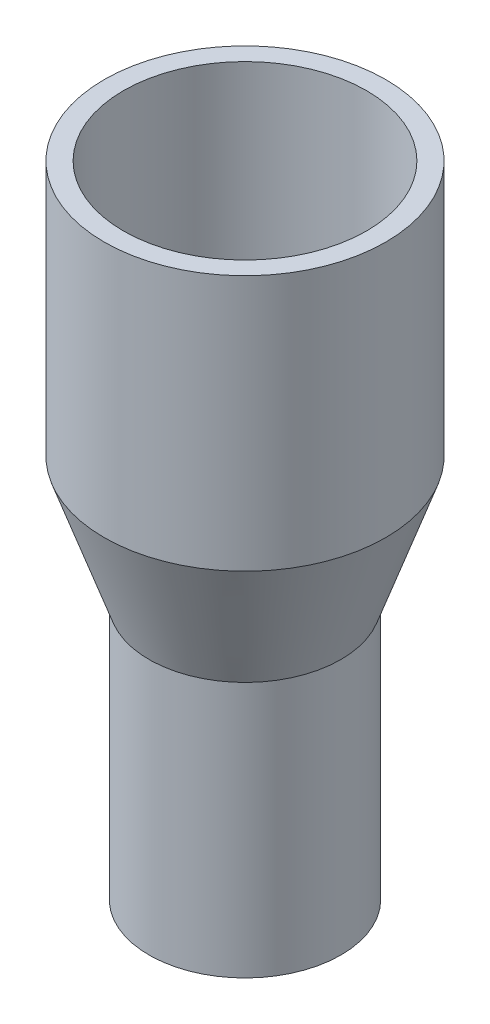
ISO-10303-21;
HEADER;
FILE_DESCRIPTION(('STEP AP214'),'2;1');
FILE_NAME('part.step','',(''),(''),'','','');
FILE_SCHEMA(('AUTOMOTIVE_DESIGN { 1 0 10303 214 1 1 1 1 }'));
ENDSEC;
DATA;
#1=APPLICATION_CONTEXT('core data for automotive mechanical design processes');
#2=APPLICATION_PROTOCOL_DEFINITION('international standard','automotive_design',2000,#1);
#3=PRODUCT_CONTEXT('',#1,'mechanical');
#4=PRODUCT('Part','Part','',(#3));
#5=PRODUCT_RELATED_PRODUCT_CATEGORY('part','',(#4));
#6=PRODUCT_DEFINITION_FORMATION('','',#4);
#7=PRODUCT_DEFINITION_CONTEXT('part definition',#1,'design');
#8=PRODUCT_DEFINITION('design','',#6,#7);
#9=PRODUCT_DEFINITION_SHAPE('','',#8);
#10=(LENGTH_UNIT() NAMED_UNIT(*) SI_UNIT(.MILLI.,.METRE.));
#11=(NAMED_UNIT(*) PLANE_ANGLE_UNIT() SI_UNIT($,.RADIAN.));
#12=(NAMED_UNIT(*) SI_UNIT($,.STERADIAN.) SOLID_ANGLE_UNIT());
#13=UNCERTAINTY_MEASURE_WITH_UNIT(LENGTH_MEASURE(1.E-05),#10,'distance_accuracy_value','');
#14=(GEOMETRIC_REPRESENTATION_CONTEXT(3) GLOBAL_UNCERTAINTY_ASSIGNED_CONTEXT((#13)) GLOBAL_UNIT_ASSIGNED_CONTEXT((#10,
#11,#12)) REPRESENTATION_CONTEXT('',''));
#15=CARTESIAN_POINT('',(0.,0.,0.));
#16=DIRECTION('',(0.,0.,1.));
#17=DIRECTION('',(1.,0.,0.));
#18=AXIS2_PLACEMENT_3D('',#15,#16,#17);
#19=CARTESIAN_POINT('',(9.49999999999999,25.,0.));
#20=DIRECTION('',(0.,1.,0.));
#21=DIRECTION('',(-1.,0.,0.));
#22=AXIS2_PLACEMENT_3D('',#19,#20,#21);
#23=PLANE('',#22);
#24=CARTESIAN_POINT('',(0.,25.,0.));
#25=DIRECTION('',(0.,-1.,0.));
#26=DIRECTION('',(1.,0.,0.));
#27=AXIS2_PLACEMENT_3D('',#24,#25,#26);
#28=CIRCLE('',#27,9.5);
#29=CARTESIAN_POINT('',(9.49999999999999,25.,0.));
#30=VERTEX_POINT('',#29);
#31=EDGE_CURVE('E60',#30,#30,#28,.T.);
#32=ORIENTED_EDGE('',*,*,#31,.T.);
#33=EDGE_LOOP('',(#32));
#34=FACE_BOUND('',#33,.T.);
#35=CARTESIAN_POINT('',(0.,25.,0.));
#36=DIRECTION('',(0.,-1.,0.));
#37=DIRECTION('',(1.,0.,0.));
#38=AXIS2_PLACEMENT_3D('',#35,#36,#37);
#39=CIRCLE('',#38,11.);
#40=CARTESIAN_POINT('',(11.,25.,0.));
#41=VERTEX_POINT('',#40);
#42=EDGE_CURVE('E10',#41,#41,#39,.T.);
#43=ORIENTED_EDGE('',*,*,#42,.F.);
#44=EDGE_LOOP('',(#43));
#45=FACE_BOUND('',#44,.T.);
#46=ADVANCED_FACE('F32',(#34,#45),#23,.T.);
#47=CARTESIAN_POINT('',(0.,-25.,0.));
#48=DIRECTION('',(0.,-1.,0.));
#49=DIRECTION('',(1.,0.,0.));
#50=AXIS2_PLACEMENT_3D('',#47,#48,#49);
#51=CYLINDRICAL_SURFACE('',#50,11.);
#52=ORIENTED_EDGE('',*,*,#42,.T.);
#53=EDGE_LOOP('',(#52));
#54=FACE_BOUND('',#53,.T.);
#55=CARTESIAN_POINT('',(0.,5.,0.));
#56=DIRECTION('',(0.,-1.,0.));
#57=DIRECTION('',(1.,0.,0.));
#58=AXIS2_PLACEMENT_3D('',#55,#56,#57);
#59=CIRCLE('',#58,11.);
#60=CARTESIAN_POINT('',(11.,5.,0.));
#61=VERTEX_POINT('',#60);
#62=EDGE_CURVE('E38',#61,#61,#59,.T.);
#63=ORIENTED_EDGE('',*,*,#62,.F.);
#64=EDGE_LOOP('',(#63));
#65=FACE_BOUND('',#64,.T.);
#66=ADVANCED_FACE('F78',(#54,#65),#51,.T.);
#67=CARTESIAN_POINT('',(0.,-5.,0.));
#68=DIRECTION('',(0.,1.,0.));
#69=DIRECTION('',(-1.,0.,0.));
#70=AXIS2_PLACEMENT_3D('',#67,#68,#69);
#71=CONICAL_SURFACE('',#70,7.5,0.336674819386727);
#72=ORIENTED_EDGE('',*,*,#62,.T.);
#73=EDGE_LOOP('',(#72));
#74=FACE_BOUND('',#73,.T.);
#75=CARTESIAN_POINT('',(0.,-5.,0.));
#76=DIRECTION('',(0.,-1.,0.));
#77=DIRECTION('',(1.,0.,0.));
#78=AXIS2_PLACEMENT_3D('',#75,#76,#77);
#79=CIRCLE('',#78,7.5);
#80=CARTESIAN_POINT('',(7.5,-5.,0.));
#81=VERTEX_POINT('',#80);
#82=EDGE_CURVE('E42',#81,#81,#79,.T.);
#83=ORIENTED_EDGE('',*,*,#82,.F.);
#84=EDGE_LOOP('',(#83));
#85=FACE_BOUND('',#84,.T.);
#86=ADVANCED_FACE('F82',(#74,#85),#71,.T.);
#87=CARTESIAN_POINT('',(0.,-25.,0.));
#88=DIRECTION('',(0.,-1.,0.));
#89=DIRECTION('',(1.,0.,0.));
#90=AXIS2_PLACEMENT_3D('',#87,#88,#89);
#91=CYLINDRICAL_SURFACE('',#90,7.50000000000001);
#92=ORIENTED_EDGE('',*,*,#82,.T.);
#93=EDGE_LOOP('',(#92));
#94=FACE_BOUND('',#93,.T.);
#95=CARTESIAN_POINT('',(0.,-25.,0.));
#96=DIRECTION('',(0.,-1.,0.));
#97=DIRECTION('',(1.,0.,0.));
#98=AXIS2_PLACEMENT_3D('',#95,#96,#97);
#99=CIRCLE('',#98,7.50000000000001);
#100=CARTESIAN_POINT('',(7.50000000000001,-25.,0.));
#101=VERTEX_POINT('',#100);
#102=EDGE_CURVE('E46',#101,#101,#99,.T.);
#103=ORIENTED_EDGE('',*,*,#102,.F.);
#104=EDGE_LOOP('',(#103));
#105=FACE_BOUND('',#104,.T.);
#106=ADVANCED_FACE('F86',(#94,#105),#91,.T.);
#107=CARTESIAN_POINT('',(7.50000000000001,-25.,0.));
#108=DIRECTION('',(0.,-1.,0.));
#109=DIRECTION('',(1.,0.,0.));
#110=AXIS2_PLACEMENT_3D('',#107,#108,#109);
#111=PLANE('',#110);
#112=ORIENTED_EDGE('',*,*,#102,.T.);
#113=EDGE_LOOP('',(#112));
#114=FACE_BOUND('',#113,.T.);
#115=CARTESIAN_POINT('',(0.,-25.,0.));
#116=DIRECTION('',(0.,-1.,0.));
#117=DIRECTION('',(1.,0.,0.));
#118=AXIS2_PLACEMENT_3D('',#115,#116,#117);
#119=CIRCLE('',#118,6.);
#120=CARTESIAN_POINT('',(6.,-25.,0.));
#121=VERTEX_POINT('',#120);
#122=EDGE_CURVE('E51',#121,#121,#119,.T.);
#123=ORIENTED_EDGE('',*,*,#122,.F.);
#124=EDGE_LOOP('',(#123));
#125=FACE_BOUND('',#124,.T.);
#126=ADVANCED_FACE('F92',(#114,#125),#111,.T.);
#127=CARTESIAN_POINT('',(0.,-25.,0.));
#128=DIRECTION('',(0.,-1.,0.));
#129=DIRECTION('',(1.,0.,0.));
#130=AXIS2_PLACEMENT_3D('',#127,#128,#129);
#131=CYLINDRICAL_SURFACE('',#130,6.);
#132=ORIENTED_EDGE('',*,*,#122,.T.);
#133=EDGE_LOOP('',(#132));
#134=FACE_BOUND('',#133,.T.);
#135=CARTESIAN_POINT('',(0.,-4.74508140705348,0.));
#136=DIRECTION('',(0.,-1.,0.));
#137=DIRECTION('',(1.,0.,0.));
#138=AXIS2_PLACEMENT_3D('',#135,#136,#137);
#139=CIRCLE('',#138,6.);
#140=CARTESIAN_POINT('',(6.,-4.74508140705348,0.));
#141=VERTEX_POINT('',#140);
#142=EDGE_CURVE('E54',#141,#141,#139,.T.);
#143=ORIENTED_EDGE('',*,*,#142,.F.);
#144=EDGE_LOOP('',(#143));
#145=FACE_BOUND('',#144,.T.);
#146=ADVANCED_FACE('F74',(#134,#145),#131,.F.);
#147=CARTESIAN_POINT('',(0.,5.25491859294652,0.));
#148=DIRECTION('',(0.,1.,0.));
#149=DIRECTION('',(-1.,0.,0.));
#150=AXIS2_PLACEMENT_3D('',#147,#148,#149);
#151=CONICAL_SURFACE('',#150,9.5,0.336674819386726);
#152=ORIENTED_EDGE('',*,*,#142,.T.);
#153=EDGE_LOOP('',(#152));
#154=FACE_BOUND('',#153,.T.);
#155=CARTESIAN_POINT('',(0.,5.25491859294652,0.));
#156=DIRECTION('',(0.,-1.,0.));
#157=DIRECTION('',(1.,0.,0.));
#158=AXIS2_PLACEMENT_3D('',#155,#156,#157);
#159=CIRCLE('',#158,9.5);
#160=CARTESIAN_POINT('',(9.49999999999999,5.25491859294652,0.));
#161=VERTEX_POINT('',#160);
#162=EDGE_CURVE('E57',#161,#161,#159,.T.);
#163=ORIENTED_EDGE('',*,*,#162,.F.);
#164=EDGE_LOOP('',(#163));
#165=FACE_BOUND('',#164,.T.);
#166=ADVANCED_FACE('F68',(#154,#165),#151,.F.);
#167=CARTESIAN_POINT('',(0.,-25.,0.));
#168=DIRECTION('',(0.,-1.,0.));
#169=DIRECTION('',(1.,0.,0.));
#170=AXIS2_PLACEMENT_3D('',#167,#168,#169);
#171=CYLINDRICAL_SURFACE('',#170,9.5);
#172=ORIENTED_EDGE('',*,*,#162,.T.);
#173=EDGE_LOOP('',(#172));
#174=FACE_BOUND('',#173,.T.);
#175=ORIENTED_EDGE('',*,*,#31,.F.);
#176=EDGE_LOOP('',(#175));
#177=FACE_BOUND('',#176,.T.);
#178=ADVANCED_FACE('F66',(#174,#177),#171,.F.);
#179=CLOSED_SHELL('',(#46,#66,#86,#106,#126,#146,#166,#178));
#180=MANIFOLD_SOLID_BREP('B2',#179);
#181=ADVANCED_BREP_SHAPE_REPRESENTATION('',(#18,#180),#14);
#182=SHAPE_DEFINITION_REPRESENTATION(#9,#181);
ENDSEC;
END-ISO-10303-21;
